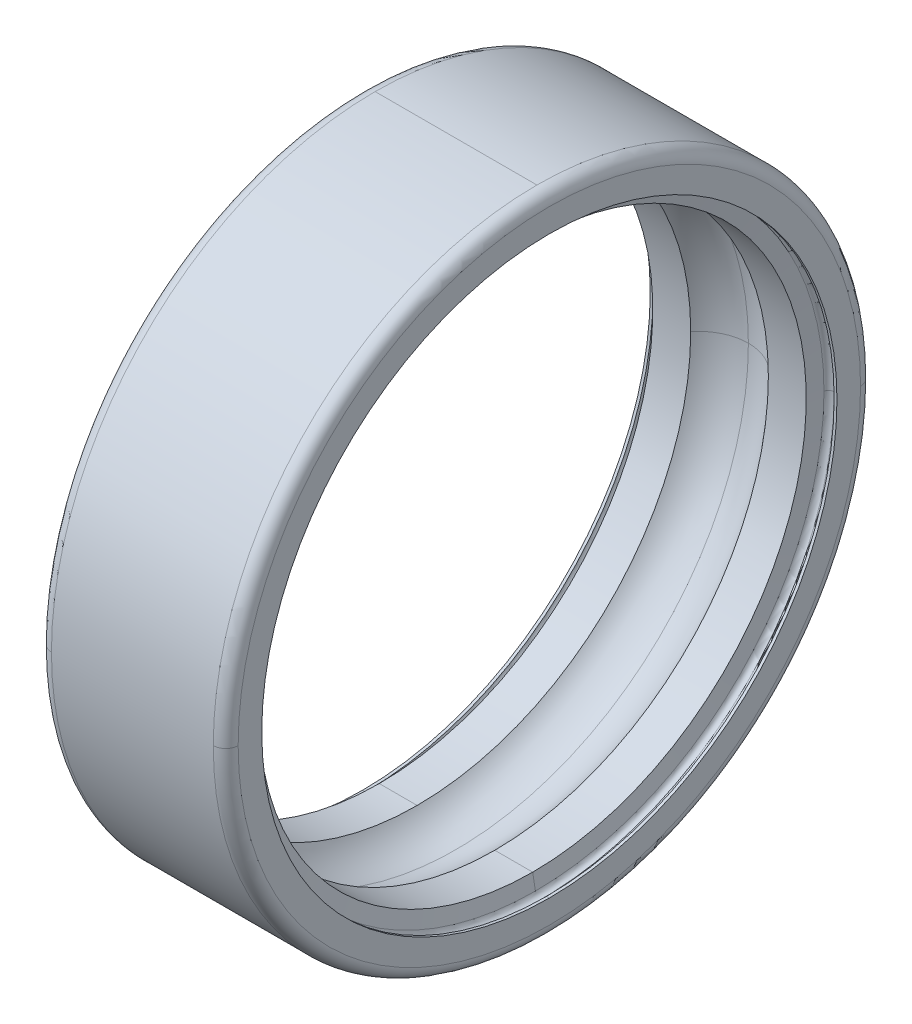
ISO-10303-21;
HEADER;
FILE_DESCRIPTION(('STEP AP214'),'2;1');
FILE_NAME('part.step','',(''),(''),'','','');
FILE_SCHEMA(('AUTOMOTIVE_DESIGN { 1 0 10303 214 1 1 1 1 }'));
ENDSEC;
DATA;
#1=APPLICATION_CONTEXT('core data for automotive mechanical design processes');
#2=APPLICATION_PROTOCOL_DEFINITION('international standard','automotive_design',2000,#1);
#3=PRODUCT_CONTEXT('',#1,'mechanical');
#4=PRODUCT('Part','Part','',(#3));
#5=PRODUCT_RELATED_PRODUCT_CATEGORY('part','',(#4));
#6=PRODUCT_DEFINITION_FORMATION('','',#4);
#7=PRODUCT_DEFINITION_CONTEXT('part definition',#1,'design');
#8=PRODUCT_DEFINITION('design','',#6,#7);
#9=PRODUCT_DEFINITION_SHAPE('','',#8);
#10=(LENGTH_UNIT() NAMED_UNIT(*) SI_UNIT(.MILLI.,.METRE.));
#11=(NAMED_UNIT(*) PLANE_ANGLE_UNIT() SI_UNIT($,.RADIAN.));
#12=(NAMED_UNIT(*) SI_UNIT($,.STERADIAN.) SOLID_ANGLE_UNIT());
#13=UNCERTAINTY_MEASURE_WITH_UNIT(LENGTH_MEASURE(1.E-05),#10,'distance_accuracy_value','');
#14=(GEOMETRIC_REPRESENTATION_CONTEXT(3) GLOBAL_UNCERTAINTY_ASSIGNED_CONTEXT((#13)) GLOBAL_UNIT_ASSIGNED_CONTEXT((#10,
#11,#12)) REPRESENTATION_CONTEXT('',''));
#15=CARTESIAN_POINT('',(0.,0.,0.));
#16=DIRECTION('',(0.,0.,1.));
#17=DIRECTION('',(1.,0.,0.));
#18=AXIS2_PLACEMENT_3D('',#15,#16,#17);
#19=CARTESIAN_POINT('',(14.322,0.,0.));
#20=DIRECTION('',(1.,0.,0.));
#21=DIRECTION('',(0.,0.,-1.));
#22=AXIS2_PLACEMENT_3D('',#19,#20,#21);
#23=TOROIDAL_SURFACE('',#22,23.105,0.452);
#24=CARTESIAN_POINT('',(14.322,0.,0.));
#25=DIRECTION('',(1.,0.,0.));
#26=DIRECTION('',(0.,0.,1.));
#27=AXIS2_PLACEMENT_3D('',#24,#25,#26);
#28=CIRCLE('',#27,23.557);
#29=CARTESIAN_POINT('',(14.322,0.,-23.557));
#30=VERTEX_POINT('',#29);
#31=CARTESIAN_POINT('',(14.322,0.,23.557));
#32=VERTEX_POINT('',#31);
#33=EDGE_CURVE('E440',#30,#32,#28,.T.);
#34=ORIENTED_EDGE('',*,*,#33,.T.);
#35=CARTESIAN_POINT('',(14.322,0.,23.105));
#36=DIRECTION('',(0.,-1.,0.));
#37=DIRECTION('',(0.,0.,1.));
#38=AXIS2_PLACEMENT_3D('',#35,#36,#37);
#39=CIRCLE('',#38,0.452);
#40=CARTESIAN_POINT('',(13.8768668956385,0.,23.1834889763055));
#41=VERTEX_POINT('',#40);
#42=EDGE_CURVE('E315',#32,#41,#39,.T.);
#43=ORIENTED_EDGE('',*,*,#42,.T.);
#44=CARTESIAN_POINT('',(13.8768668956385,0.,0.));
#45=DIRECTION('',(1.,0.,0.));
#46=DIRECTION('',(0.,1.,0.));
#47=AXIS2_PLACEMENT_3D('',#44,#45,#46);
#48=CIRCLE('',#47,23.1834889763055);
#49=CARTESIAN_POINT('',(13.8768668956385,23.1834889763055,0.));
#50=VERTEX_POINT('',#49);
#51=EDGE_CURVE('E30',#50,#41,#48,.T.);
#52=ORIENTED_EDGE('',*,*,#51,.F.);
#53=CARTESIAN_POINT('',(13.8768668956385,0.,0.));
#54=DIRECTION('',(1.,0.,0.));
#55=DIRECTION('',(0.,1.,0.));
#56=AXIS2_PLACEMENT_3D('',#53,#54,#55);
#57=CIRCLE('',#56,23.1834889763055);
#58=CARTESIAN_POINT('',(13.8768668956385,0.,-23.1834889763055));
#59=VERTEX_POINT('',#58);
#60=EDGE_CURVE('E214',#59,#50,#57,.T.);
#61=ORIENTED_EDGE('',*,*,#60,.F.);
#62=CARTESIAN_POINT('',(14.322,0.,-23.105));
#63=DIRECTION('',(0.,-1.,0.));
#64=DIRECTION('',(0.,0.,-1.));
#65=AXIS2_PLACEMENT_3D('',#62,#63,#64);
#66=CIRCLE('',#65,0.452);
#67=EDGE_CURVE('E301',#59,#30,#66,.T.);
#68=ORIENTED_EDGE('',*,*,#67,.T.);
#69=EDGE_LOOP('',(#34,#43,#52,#61,#68));
#70=FACE_BOUND('',#69,.T.);
#71=ADVANCED_FACE('F16',(#70),#23,.F.);
#72=CARTESIAN_POINT('',(14.887,0.,0.));
#73=DIRECTION('',(1.,0.,0.));
#74=DIRECTION('',(0.,1.,0.));
#75=AXIS2_PLACEMENT_3D('',#72,#73,#74);
#76=CYLINDRICAL_SURFACE('',#75,23.105);
#77=DIRECTION('',(1.,0.,0.));
#78=VECTOR('',#77,1.);
#79=CARTESIAN_POINT('',(14.887,23.105,0.));
#80=LINE('',#79,#78);
#81=CARTESIAN_POINT('',(14.774,23.105,0.));
#82=VERTEX_POINT('',#81);
#83=CARTESIAN_POINT('',(15.,23.105,0.));
#84=VERTEX_POINT('',#83);
#85=EDGE_CURVE('E318',#82,#84,#80,.T.);
#86=ORIENTED_EDGE('',*,*,#85,.T.);
#87=CARTESIAN_POINT('',(15.,0.,0.));
#88=DIRECTION('',(1.,0.,0.));
#89=DIRECTION('',(0.,1.,0.));
#90=AXIS2_PLACEMENT_3D('',#87,#88,#89);
#91=CIRCLE('',#90,23.105);
#92=CARTESIAN_POINT('',(15.,-23.105,0.));
#93=VERTEX_POINT('',#92);
#94=EDGE_CURVE('E11',#84,#93,#91,.T.);
#95=ORIENTED_EDGE('',*,*,#94,.T.);
#96=DIRECTION('',(-1.,0.,0.));
#97=VECTOR('',#96,1.);
#98=CARTESIAN_POINT('',(14.887,-23.105,0.));
#99=LINE('',#98,#97);
#100=CARTESIAN_POINT('',(14.774,-23.105,0.));
#101=VERTEX_POINT('',#100);
#102=EDGE_CURVE('E323',#93,#101,#99,.T.);
#103=ORIENTED_EDGE('',*,*,#102,.T.);
#104=CARTESIAN_POINT('',(14.774,0.,0.));
#105=DIRECTION('',(1.,0.,0.));
#106=DIRECTION('',(0.,1.,0.));
#107=AXIS2_PLACEMENT_3D('',#104,#105,#106);
#108=CIRCLE('',#107,23.105);
#109=CARTESIAN_POINT('',(14.774,0.,23.105));
#110=VERTEX_POINT('',#109);
#111=EDGE_CURVE('E290',#110,#101,#108,.T.);
#112=ORIENTED_EDGE('',*,*,#111,.F.);
#113=CARTESIAN_POINT('',(14.774,0.,0.));
#114=DIRECTION('',(1.,0.,0.));
#115=DIRECTION('',(0.,1.,0.));
#116=AXIS2_PLACEMENT_3D('',#113,#114,#115);
#117=CIRCLE('',#116,23.105);
#118=EDGE_CURVE('E443',#82,#110,#117,.T.);
#119=ORIENTED_EDGE('',*,*,#118,.F.);
#120=EDGE_LOOP('',(#86,#95,#103,#112,#119));
#121=FACE_BOUND('',#120,.T.);
#122=ADVANCED_FACE('F498',(#121),#76,.F.);
#123=CARTESIAN_POINT('',(15.,24.0525,0.));
#124=DIRECTION('',(1.,0.,0.));
#125=DIRECTION('',(0.,1.,0.));
#126=AXIS2_PLACEMENT_3D('',#123,#124,#125);
#127=PLANE('',#126);
#128=ORIENTED_EDGE('',*,*,#94,.F.);
#129=CARTESIAN_POINT('',(15.,0.,0.));
#130=DIRECTION('',(1.,0.,0.));
#131=DIRECTION('',(0.,1.,0.));
#132=AXIS2_PLACEMENT_3D('',#129,#130,#131);
#133=CIRCLE('',#132,23.105);
#134=EDGE_CURVE('E326',#93,#84,#133,.T.);
#135=ORIENTED_EDGE('',*,*,#134,.F.);
#136=EDGE_LOOP('',(#128,#135));
#137=FACE_BOUND('',#136,.T.);
#138=CARTESIAN_POINT('',(15.,0.,0.));
#139=DIRECTION('',(1.,0.,0.));
#140=DIRECTION('',(0.,1.,0.));
#141=AXIS2_PLACEMENT_3D('',#138,#139,#140);
#142=CIRCLE('',#141,25.);
#143=CARTESIAN_POINT('',(15.,0.,25.));
#144=VERTEX_POINT('',#143);
#145=CARTESIAN_POINT('',(15.,0.,-25.));
#146=VERTEX_POINT('',#145);
#147=EDGE_CURVE('E23',#144,#146,#142,.T.);
#148=ORIENTED_EDGE('',*,*,#147,.T.);
#149=CARTESIAN_POINT('',(15.,0.,0.));
#150=DIRECTION('',(1.,0.,0.));
#151=DIRECTION('',(0.,1.,0.));
#152=AXIS2_PLACEMENT_3D('',#149,#150,#151);
#153=CIRCLE('',#152,25.);
#154=EDGE_CURVE('E340',#146,#144,#153,.T.);
#155=ORIENTED_EDGE('',*,*,#154,.T.);
#156=EDGE_LOOP('',(#148,#155));
#157=FACE_BOUND('',#156,.T.);
#158=ADVANCED_FACE('F500',(#137,#157),#127,.T.);
#159=CARTESIAN_POINT('',(14.,0.,0.));
#160=DIRECTION('',(1.,0.,0.));
#161=DIRECTION('',(0.,0.,-1.));
#162=AXIS2_PLACEMENT_3D('',#159,#160,#161);
#163=TOROIDAL_SURFACE('',#162,25.,1.);
#164=CARTESIAN_POINT('',(14.,0.,-25.));
#165=DIRECTION('',(0.,-1.,0.));
#166=DIRECTION('',(0.,0.,-1.));
#167=AXIS2_PLACEMENT_3D('',#164,#165,#166);
#168=CIRCLE('',#167,1.);
#169=CARTESIAN_POINT('',(14.,0.,-26.));
#170=VERTEX_POINT('',#169);
#171=EDGE_CURVE('E330',#170,#146,#168,.T.);
#172=ORIENTED_EDGE('',*,*,#171,.T.);
#173=ORIENTED_EDGE('',*,*,#147,.F.);
#174=CARTESIAN_POINT('',(14.,0.,25.));
#175=DIRECTION('',(0.,-1.,0.));
#176=DIRECTION('',(0.,0.,1.));
#177=AXIS2_PLACEMENT_3D('',#174,#175,#176);
#178=CIRCLE('',#177,1.);
#179=CARTESIAN_POINT('',(14.,0.,26.));
#180=VERTEX_POINT('',#179);
#181=EDGE_CURVE('E337',#144,#180,#178,.T.);
#182=ORIENTED_EDGE('',*,*,#181,.T.);
#183=CARTESIAN_POINT('',(14.,0.,0.));
#184=DIRECTION('',(1.,0.,0.));
#185=DIRECTION('',(0.,1.,0.));
#186=AXIS2_PLACEMENT_3D('',#183,#184,#185);
#187=CIRCLE('',#186,26.);
#188=CARTESIAN_POINT('',(14.,-26.,0.));
#189=VERTEX_POINT('',#188);
#190=EDGE_CURVE('E354',#180,#189,#187,.T.);
#191=ORIENTED_EDGE('',*,*,#190,.T.);
#192=CARTESIAN_POINT('',(14.,0.,0.));
#193=DIRECTION('',(1.,0.,0.));
#194=DIRECTION('',(0.,1.,0.));
#195=AXIS2_PLACEMENT_3D('',#192,#193,#194);
#196=CIRCLE('',#195,26.);
#197=EDGE_CURVE('E224',#189,#170,#196,.T.);
#198=ORIENTED_EDGE('',*,*,#197,.T.);
#199=EDGE_LOOP('',(#172,#173,#182,#191,#198));
#200=FACE_BOUND('',#199,.T.);
#201=ADVANCED_FACE('F503',(#200),#163,.T.);
#202=CARTESIAN_POINT('',(7.5,0.,0.));
#203=DIRECTION('',(1.,0.,0.));
#204=DIRECTION('',(0.,1.,0.));
#205=AXIS2_PLACEMENT_3D('',#202,#203,#204);
#206=CYLINDRICAL_SURFACE('',#205,26.);
#207=DIRECTION('',(1.,0.,0.));
#208=VECTOR('',#207,1.);
#209=CARTESIAN_POINT('',(7.5,26.,0.));
#210=LINE('',#209,#208);
#211=CARTESIAN_POINT('',(1.,26.,0.));
#212=VERTEX_POINT('',#211);
#213=CARTESIAN_POINT('',(14.,26.,0.));
#214=VERTEX_POINT('',#213);
#215=EDGE_CURVE('E343',#212,#214,#210,.T.);
#216=ORIENTED_EDGE('',*,*,#215,.T.);
#217=CARTESIAN_POINT('',(14.,0.,0.));
#218=DIRECTION('',(1.,0.,0.));
#219=DIRECTION('',(0.,1.,0.));
#220=AXIS2_PLACEMENT_3D('',#217,#218,#219);
#221=CIRCLE('',#220,26.);
#222=EDGE_CURVE('E331',#170,#214,#221,.T.);
#223=ORIENTED_EDGE('',*,*,#222,.F.);
#224=ORIENTED_EDGE('',*,*,#197,.F.);
#225=DIRECTION('',(-1.,0.,0.));
#226=VECTOR('',#225,1.);
#227=CARTESIAN_POINT('',(7.5,-26.,0.));
#228=LINE('',#227,#226);
#229=CARTESIAN_POINT('',(1.,-26.,0.));
#230=VERTEX_POINT('',#229);
#231=EDGE_CURVE('E351',#189,#230,#228,.T.);
#232=ORIENTED_EDGE('',*,*,#231,.T.);
#233=CARTESIAN_POINT('',(1.,0.,0.));
#234=DIRECTION('',(1.,0.,0.));
#235=DIRECTION('',(0.,1.,0.));
#236=AXIS2_PLACEMENT_3D('',#233,#234,#235);
#237=CIRCLE('',#236,26.);
#238=CARTESIAN_POINT('',(1.,0.,-26.));
#239=VERTEX_POINT('',#238);
#240=EDGE_CURVE('E219',#230,#239,#237,.T.);
#241=ORIENTED_EDGE('',*,*,#240,.T.);
#242=CARTESIAN_POINT('',(1.,0.,0.));
#243=DIRECTION('',(1.,0.,0.));
#244=DIRECTION('',(0.,1.,0.));
#245=AXIS2_PLACEMENT_3D('',#242,#243,#244);
#246=CIRCLE('',#245,26.);
#247=EDGE_CURVE('E364',#239,#212,#246,.T.);
#248=ORIENTED_EDGE('',*,*,#247,.T.);
#249=EDGE_LOOP('',(#216,#223,#224,#232,#241,#248));
#250=FACE_BOUND('',#249,.T.);
#251=ADVANCED_FACE('F420',(#250),#206,.T.);
#252=CARTESIAN_POINT('',(1.,0.,0.));
#253=DIRECTION('',(1.,0.,0.));
#254=DIRECTION('',(0.,0.,-1.));
#255=AXIS2_PLACEMENT_3D('',#252,#253,#254);
#256=TOROIDAL_SURFACE('',#255,25.,1.);
#257=CARTESIAN_POINT('',(1.,0.,-25.));
#258=DIRECTION('',(0.,-1.,0.));
#259=DIRECTION('',(0.,0.,-1.));
#260=AXIS2_PLACEMENT_3D('',#257,#258,#259);
#261=CIRCLE('',#260,1.);
#262=CARTESIAN_POINT('',(0.,0.,-25.));
#263=VERTEX_POINT('',#262);
#264=EDGE_CURVE('E357',#263,#239,#261,.T.);
#265=ORIENTED_EDGE('',*,*,#264,.T.);
#266=ORIENTED_EDGE('',*,*,#240,.F.);
#267=CARTESIAN_POINT('',(1.,0.,0.));
#268=DIRECTION('',(1.,0.,0.));
#269=DIRECTION('',(0.,1.,0.));
#270=AXIS2_PLACEMENT_3D('',#267,#268,#269);
#271=CIRCLE('',#270,26.);
#272=CARTESIAN_POINT('',(1.,0.,26.));
#273=VERTEX_POINT('',#272);
#274=EDGE_CURVE('E348',#273,#230,#271,.T.);
#275=ORIENTED_EDGE('',*,*,#274,.F.);
#276=CARTESIAN_POINT('',(1.,0.,25.));
#277=DIRECTION('',(0.,-1.,0.));
#278=DIRECTION('',(0.,0.,1.));
#279=AXIS2_PLACEMENT_3D('',#276,#277,#278);
#280=CIRCLE('',#279,1.);
#281=CARTESIAN_POINT('',(0.,0.,25.));
#282=VERTEX_POINT('',#281);
#283=EDGE_CURVE('E362',#273,#282,#280,.T.);
#284=ORIENTED_EDGE('',*,*,#283,.T.);
#285=CARTESIAN_POINT('',(0.,0.,0.));
#286=DIRECTION('',(1.,0.,0.));
#287=DIRECTION('',(0.,1.,0.));
#288=AXIS2_PLACEMENT_3D('',#285,#286,#287);
#289=CIRCLE('',#288,25.);
#290=EDGE_CURVE('E218',#282,#263,#289,.T.);
#291=ORIENTED_EDGE('',*,*,#290,.T.);
#292=EDGE_LOOP('',(#265,#266,#275,#284,#291));
#293=FACE_BOUND('',#292,.T.);
#294=ADVANCED_FACE('F410',(#293),#256,.T.);
#295=CARTESIAN_POINT('',(0.,24.0525,0.));
#296=DIRECTION('',(-1.,0.,0.));
#297=DIRECTION('',(0.,0.,1.));
#298=AXIS2_PLACEMENT_3D('',#295,#296,#297);
#299=PLANE('',#298);
#300=CARTESIAN_POINT('',(0.,0.,0.));
#301=DIRECTION('',(1.,0.,0.));
#302=DIRECTION('',(0.,1.,0.));
#303=AXIS2_PLACEMENT_3D('',#300,#301,#302);
#304=CIRCLE('',#303,23.105);
#305=CARTESIAN_POINT('',(0.,23.105,0.));
#306=VERTEX_POINT('',#305);
#307=CARTESIAN_POINT('',(0.,-23.105,0.));
#308=VERTEX_POINT('',#307);
#309=EDGE_CURVE('E217',#306,#308,#304,.T.);
#310=ORIENTED_EDGE('',*,*,#309,.T.);
#311=CARTESIAN_POINT('',(0.,0.,0.));
#312=DIRECTION('',(1.,0.,0.));
#313=DIRECTION('',(0.,1.,0.));
#314=AXIS2_PLACEMENT_3D('',#311,#312,#313);
#315=CIRCLE('',#314,23.105);
#316=EDGE_CURVE('E265',#308,#306,#315,.T.);
#317=ORIENTED_EDGE('',*,*,#316,.T.);
#318=EDGE_LOOP('',(#310,#317));
#319=FACE_BOUND('',#318,.T.);
#320=CARTESIAN_POINT('',(0.,0.,0.));
#321=DIRECTION('',(1.,0.,0.));
#322=DIRECTION('',(0.,1.,0.));
#323=AXIS2_PLACEMENT_3D('',#320,#321,#322);
#324=CIRCLE('',#323,25.);
#325=EDGE_CURVE('E359',#263,#282,#324,.T.);
#326=ORIENTED_EDGE('',*,*,#325,.F.);
#327=ORIENTED_EDGE('',*,*,#290,.F.);
#328=EDGE_LOOP('',(#326,#327));
#329=FACE_BOUND('',#328,.T.);
#330=ADVANCED_FACE('F407',(#319,#329),#299,.T.);
#331=CARTESIAN_POINT('',(0.113,0.,0.));
#332=DIRECTION('',(1.,0.,0.));
#333=DIRECTION('',(0.,1.,0.));
#334=AXIS2_PLACEMENT_3D('',#331,#332,#333);
#335=CYLINDRICAL_SURFACE('',#334,23.105);
#336=DIRECTION('',(1.,0.,0.));
#337=VECTOR('',#336,1.);
#338=CARTESIAN_POINT('',(0.113,23.105,0.));
#339=LINE('',#338,#337);
#340=CARTESIAN_POINT('',(0.226,23.105,0.));
#341=VERTEX_POINT('',#340);
#342=EDGE_CURVE('E268',#306,#341,#339,.T.);
#343=ORIENTED_EDGE('',*,*,#342,.T.);
#344=CARTESIAN_POINT('',(0.226,0.,0.));
#345=DIRECTION('',(1.,0.,0.));
#346=DIRECTION('',(0.,1.,0.));
#347=AXIS2_PLACEMENT_3D('',#344,#345,#346);
#348=CIRCLE('',#347,23.105);
#349=CARTESIAN_POINT('',(0.226,0.,23.105));
#350=VERTEX_POINT('',#349);
#351=EDGE_CURVE('E216',#341,#350,#348,.T.);
#352=ORIENTED_EDGE('',*,*,#351,.T.);
#353=CARTESIAN_POINT('',(0.226,0.,0.));
#354=DIRECTION('',(1.,0.,0.));
#355=DIRECTION('',(0.,1.,0.));
#356=AXIS2_PLACEMENT_3D('',#353,#354,#355);
#357=CIRCLE('',#356,23.105);
#358=CARTESIAN_POINT('',(0.226,-23.105,0.));
#359=VERTEX_POINT('',#358);
#360=EDGE_CURVE('E295',#350,#359,#357,.T.);
#361=ORIENTED_EDGE('',*,*,#360,.T.);
#362=DIRECTION('',(-1.,0.,0.));
#363=VECTOR('',#362,1.);
#364=CARTESIAN_POINT('',(0.113,-23.105,0.));
#365=LINE('',#364,#363);
#366=EDGE_CURVE('E267',#359,#308,#365,.T.);
#367=ORIENTED_EDGE('',*,*,#366,.T.);
#368=ORIENTED_EDGE('',*,*,#309,.F.);
#369=EDGE_LOOP('',(#343,#352,#361,#367,#368));
#370=FACE_BOUND('',#369,.T.);
#371=ADVANCED_FACE('F402',(#370),#335,.F.);
#372=CARTESIAN_POINT('',(0.678,0.,0.));
#373=DIRECTION('',(1.,0.,0.));
#374=DIRECTION('',(0.,0.,-1.));
#375=AXIS2_PLACEMENT_3D('',#372,#373,#374);
#376=TOROIDAL_SURFACE('',#375,23.105,0.452);
#377=CARTESIAN_POINT('',(0.678,0.,0.));
#378=DIRECTION('',(1.,0.,0.));
#379=DIRECTION('',(0.,0.,1.));
#380=AXIS2_PLACEMENT_3D('',#377,#378,#379);
#381=CIRCLE('',#380,23.557);
#382=CARTESIAN_POINT('',(0.678,0.,-23.557));
#383=VERTEX_POINT('',#382);
#384=CARTESIAN_POINT('',(0.678,0.,23.557));
#385=VERTEX_POINT('',#384);
#386=EDGE_CURVE('E240',#383,#385,#381,.T.);
#387=ORIENTED_EDGE('',*,*,#386,.T.);
#388=CARTESIAN_POINT('',(0.678,0.,23.105));
#389=DIRECTION('',(0.,-1.,0.));
#390=DIRECTION('',(0.,0.,1.));
#391=AXIS2_PLACEMENT_3D('',#388,#389,#390);
#392=CIRCLE('',#391,0.452);
#393=EDGE_CURVE('E291',#385,#350,#392,.T.);
#394=ORIENTED_EDGE('',*,*,#393,.T.);
#395=ORIENTED_EDGE('',*,*,#351,.F.);
#396=CARTESIAN_POINT('',(0.226,0.,0.));
#397=DIRECTION('',(1.,0.,0.));
#398=DIRECTION('',(0.,1.,0.));
#399=AXIS2_PLACEMENT_3D('',#396,#397,#398);
#400=CIRCLE('',#399,23.105);
#401=CARTESIAN_POINT('',(0.226,0.,-23.105));
#402=VERTEX_POINT('',#401);
#403=EDGE_CURVE('E279',#402,#341,#400,.T.);
#404=ORIENTED_EDGE('',*,*,#403,.F.);
#405=CARTESIAN_POINT('',(0.678,0.,-23.105));
#406=DIRECTION('',(0.,-1.,0.));
#407=DIRECTION('',(0.,0.,-1.));
#408=AXIS2_PLACEMENT_3D('',#405,#406,#407);
#409=CIRCLE('',#408,0.452);
#410=EDGE_CURVE('E282',#402,#383,#409,.T.);
#411=ORIENTED_EDGE('',*,*,#410,.T.);
#412=EDGE_LOOP('',(#387,#394,#395,#404,#411));
#413=FACE_BOUND('',#412,.T.);
#414=ADVANCED_FACE('F394',(#413),#376,.F.);
#415=CARTESIAN_POINT('',(1.22967771056722,0.,0.));
#416=DIRECTION('',(-1.,0.,0.));
#417=DIRECTION('',(0.,1.,0.));
#418=AXIS2_PLACEMENT_3D('',#415,#416,#417);
#419=CONICAL_SURFACE('',#418,22.5792444881527,1.39626340159546);
#420=DIRECTION('',(0.173648177666931,-0.984807753012208,0.));
#421=VECTOR('',#420,1.);
#422=CARTESIAN_POINT('',(1.22967771056722,22.5792444881527,0.));
#423=LINE('',#422,#421);
#424=CARTESIAN_POINT('',(1.12313310436152,23.1834889763055,0.));
#425=VERTEX_POINT('',#424);
#426=CARTESIAN_POINT('',(1.33622231677292,21.975,0.));
#427=VERTEX_POINT('',#426);
#428=EDGE_CURVE('E294',#425,#427,#423,.T.);
#429=ORIENTED_EDGE('',*,*,#428,.T.);
#430=CARTESIAN_POINT('',(1.33622231677292,0.,0.));
#431=DIRECTION('',(1.,0.,0.));
#432=DIRECTION('',(0.,1.,0.));
#433=AXIS2_PLACEMENT_3D('',#430,#431,#432);
#434=CIRCLE('',#433,21.975);
#435=CARTESIAN_POINT('',(1.33622231677292,-21.975,0.));
#436=VERTEX_POINT('',#435);
#437=EDGE_CURVE('E181',#427,#436,#434,.T.);
#438=ORIENTED_EDGE('',*,*,#437,.T.);
#439=DIRECTION('',(-0.173648177666931,-0.984807753012208,0.));
#440=VECTOR('',#439,1.);
#441=CARTESIAN_POINT('',(1.22967771056722,-22.5792444881527,0.));
#442=LINE('',#441,#440);
#443=CARTESIAN_POINT('',(1.12313310436152,-23.1834889763055,0.));
#444=VERTEX_POINT('',#443);
#445=EDGE_CURVE('E302',#436,#444,#442,.T.);
#446=ORIENTED_EDGE('',*,*,#445,.T.);
#447=CARTESIAN_POINT('',(1.12313310436152,0.,0.));
#448=DIRECTION('',(1.,0.,0.));
#449=DIRECTION('',(0.,1.,0.));
#450=AXIS2_PLACEMENT_3D('',#447,#448,#449);
#451=CIRCLE('',#450,23.1834889763055);
#452=CARTESIAN_POINT('',(1.12313310436152,0.,23.1834889763055));
#453=VERTEX_POINT('',#452);
#454=EDGE_CURVE('E278',#453,#444,#451,.T.);
#455=ORIENTED_EDGE('',*,*,#454,.F.);
#456=CARTESIAN_POINT('',(1.12313310436152,0.,0.));
#457=DIRECTION('',(1.,0.,0.));
#458=DIRECTION('',(0.,1.,0.));
#459=AXIS2_PLACEMENT_3D('',#456,#457,#458);
#460=CIRCLE('',#459,23.1834889763055);
#461=EDGE_CURVE('E237',#425,#453,#460,.T.);
#462=ORIENTED_EDGE('',*,*,#461,.F.);
#463=EDGE_LOOP('',(#429,#438,#446,#455,#462));
#464=FACE_BOUND('',#463,.T.);
#465=ADVANCED_FACE('F383',(#464),#419,.F.);
#466=CARTESIAN_POINT('',(2.85878951100258,0.,0.));
#467=DIRECTION('',(1.,0.,0.));
#468=DIRECTION('',(0.,1.,0.));
#469=AXIS2_PLACEMENT_3D('',#466,#467,#468);
#470=CYLINDRICAL_SURFACE('',#469,21.975);
#471=DIRECTION('',(1.,0.,0.));
#472=VECTOR('',#471,1.);
#473=CARTESIAN_POINT('',(2.85878951100258,21.975,0.));
#474=LINE('',#473,#472);
#475=CARTESIAN_POINT('',(4.38135670523223,21.975,0.));
#476=VERTEX_POINT('',#475);
#477=EDGE_CURVE('E177',#427,#476,#474,.T.);
#478=ORIENTED_EDGE('',*,*,#477,.T.);
#479=CARTESIAN_POINT('',(4.38135670523223,0.,0.));
#480=DIRECTION('',(1.,0.,0.));
#481=DIRECTION('',(0.,1.,0.));
#482=AXIS2_PLACEMENT_3D('',#479,#480,#481);
#483=CIRCLE('',#482,21.975);
#484=CARTESIAN_POINT('',(4.38135670523223,0.,21.975));
#485=VERTEX_POINT('',#484);
#486=EDGE_CURVE('E169',#476,#485,#483,.T.);
#487=ORIENTED_EDGE('',*,*,#486,.T.);
#488=CARTESIAN_POINT('',(4.38135670523223,0.,0.));
#489=DIRECTION('',(1.,0.,0.));
#490=DIRECTION('',(0.,1.,0.));
#491=AXIS2_PLACEMENT_3D('',#488,#489,#490);
#492=CIRCLE('',#491,21.975);
#493=CARTESIAN_POINT('',(4.38135670523223,-21.975,0.));
#494=VERTEX_POINT('',#493);
#495=EDGE_CURVE('E174',#485,#494,#492,.T.);
#496=ORIENTED_EDGE('',*,*,#495,.T.);
#497=DIRECTION('',(-1.,0.,0.));
#498=VECTOR('',#497,1.);
#499=CARTESIAN_POINT('',(2.85878951100258,-21.975,0.));
#500=LINE('',#499,#498);
#501=EDGE_CURVE('E320',#494,#436,#500,.T.);
#502=ORIENTED_EDGE('',*,*,#501,.T.);
#503=ORIENTED_EDGE('',*,*,#437,.F.);
#504=EDGE_LOOP('',(#478,#487,#496,#502,#503));
#505=FACE_BOUND('',#504,.T.);
#506=ADVANCED_FACE('F171',(#505),#470,.F.);
#507=CARTESIAN_POINT('',(7.5,0.,0.));
#508=DIRECTION('',(1.,0.,0.));
#509=DIRECTION('',(0.,0.,-1.));
#510=AXIS2_PLACEMENT_3D('',#507,#508,#509);
#511=TOROIDAL_SURFACE('',#510,19.52,3.969);
#512=CARTESIAN_POINT('',(7.5,0.,0.));
#513=DIRECTION('',(1.,0.,0.));
#514=DIRECTION('',(0.,0.,1.));
#515=AXIS2_PLACEMENT_3D('',#512,#513,#514);
#516=CIRCLE('',#515,23.489);
#517=CARTESIAN_POINT('',(7.5,0.,-23.489));
#518=VERTEX_POINT('',#517);
#519=CARTESIAN_POINT('',(7.5,0.,23.489));
#520=VERTEX_POINT('',#519);
#521=EDGE_CURVE('E188',#518,#520,#516,.T.);
#522=ORIENTED_EDGE('',*,*,#521,.T.);
#523=CARTESIAN_POINT('',(7.5,0.,19.52));
#524=DIRECTION('',(0.,-1.,0.));
#525=DIRECTION('',(0.,0.,1.));
#526=AXIS2_PLACEMENT_3D('',#523,#524,#525);
#527=CIRCLE('',#526,3.969);
#528=EDGE_CURVE('E184',#520,#485,#527,.T.);
#529=ORIENTED_EDGE('',*,*,#528,.T.);
#530=ORIENTED_EDGE('',*,*,#486,.F.);
#531=CARTESIAN_POINT('',(4.38135670523223,0.,0.));
#532=DIRECTION('',(1.,0.,0.));
#533=DIRECTION('',(0.,1.,0.));
#534=AXIS2_PLACEMENT_3D('',#531,#532,#533);
#535=CIRCLE('',#534,21.975);
#536=CARTESIAN_POINT('',(4.38135670523223,0.,-21.975));
#537=VERTEX_POINT('',#536);
#538=EDGE_CURVE('E200',#537,#476,#535,.T.);
#539=ORIENTED_EDGE('',*,*,#538,.F.);
#540=CARTESIAN_POINT('',(7.5,0.,-19.52));
#541=DIRECTION('',(0.,-1.,0.));
#542=DIRECTION('',(0.,0.,-1.));
#543=AXIS2_PLACEMENT_3D('',#540,#541,#542);
#544=CIRCLE('',#543,3.969);
#545=EDGE_CURVE('E198',#537,#518,#544,.T.);
#546=ORIENTED_EDGE('',*,*,#545,.T.);
#547=EDGE_LOOP('',(#522,#529,#530,#539,#546));
#548=FACE_BOUND('',#547,.T.);
#549=ADVANCED_FACE('F185',(#548),#511,.F.);
#550=CARTESIAN_POINT('',(12.1412104889974,0.,0.));
#551=DIRECTION('',(1.,0.,0.));
#552=DIRECTION('',(0.,1.,0.));
#553=AXIS2_PLACEMENT_3D('',#550,#551,#552);
#554=CYLINDRICAL_SURFACE('',#553,21.975);
#555=DIRECTION('',(1.,0.,0.));
#556=VECTOR('',#555,1.);
#557=CARTESIAN_POINT('',(12.1412104889974,21.975,0.));
#558=LINE('',#557,#556);
#559=CARTESIAN_POINT('',(10.6186432947678,21.975,0.));
#560=VERTEX_POINT('',#559);
#561=CARTESIAN_POINT('',(13.6637776832271,21.975,0.));
#562=VERTEX_POINT('',#561);
#563=EDGE_CURVE('E192',#560,#562,#558,.T.);
#564=ORIENTED_EDGE('',*,*,#563,.T.);
#565=CARTESIAN_POINT('',(13.6637776832271,0.,0.));
#566=DIRECTION('',(1.,0.,0.));
#567=DIRECTION('',(0.,1.,0.));
#568=AXIS2_PLACEMENT_3D('',#565,#566,#567);
#569=CIRCLE('',#568,21.975);
#570=CARTESIAN_POINT('',(13.6637776832271,-21.975,0.));
#571=VERTEX_POINT('',#570);
#572=EDGE_CURVE('E39',#562,#571,#569,.T.);
#573=ORIENTED_EDGE('',*,*,#572,.T.);
#574=DIRECTION('',(-1.,0.,0.));
#575=VECTOR('',#574,1.);
#576=CARTESIAN_POINT('',(12.1412104889974,-21.975,0.));
#577=LINE('',#576,#575);
#578=CARTESIAN_POINT('',(10.6186432947678,-21.975,0.));
#579=VERTEX_POINT('',#578);
#580=EDGE_CURVE('E204',#571,#579,#577,.T.);
#581=ORIENTED_EDGE('',*,*,#580,.T.);
#582=CARTESIAN_POINT('',(10.6186432947678,0.,0.));
#583=DIRECTION('',(1.,0.,0.));
#584=DIRECTION('',(0.,1.,0.));
#585=AXIS2_PLACEMENT_3D('',#582,#583,#584);
#586=CIRCLE('',#585,21.975);
#587=CARTESIAN_POINT('',(10.6186432947678,0.,21.975));
#588=VERTEX_POINT('',#587);
#589=EDGE_CURVE('E264',#588,#579,#586,.T.);
#590=ORIENTED_EDGE('',*,*,#589,.F.);
#591=CARTESIAN_POINT('',(10.6186432947678,0.,0.));
#592=DIRECTION('',(1.,0.,0.));
#593=DIRECTION('',(0.,1.,0.));
#594=AXIS2_PLACEMENT_3D('',#591,#592,#593);
#595=CIRCLE('',#594,21.975);
#596=EDGE_CURVE('E254',#560,#588,#595,.T.);
#597=ORIENTED_EDGE('',*,*,#596,.F.);
#598=EDGE_LOOP('',(#564,#573,#581,#590,#597));
#599=FACE_BOUND('',#598,.T.);
#600=ADVANCED_FACE('F476',(#599),#554,.F.);
#601=CARTESIAN_POINT('',(13.7703222894328,0.,0.));
#602=DIRECTION('',(1.,0.,0.));
#603=DIRECTION('',(0.,1.,0.));
#604=AXIS2_PLACEMENT_3D('',#601,#602,#603);
#605=CONICAL_SURFACE('',#604,22.5792444881527,1.39626340159547);
#606=DIRECTION('',(0.173648177666928,0.984807753012208,0.));
#607=VECTOR('',#606,1.);
#608=CARTESIAN_POINT('',(13.7703222894328,22.5792444881527,0.));
#609=LINE('',#608,#607);
#610=EDGE_CURVE('E209',#562,#50,#609,.T.);
#611=ORIENTED_EDGE('',*,*,#610,.T.);
#612=ORIENTED_EDGE('',*,*,#51,.T.);
#613=CARTESIAN_POINT('',(13.8768668956385,0.,0.));
#614=DIRECTION('',(1.,0.,0.));
#615=DIRECTION('',(0.,1.,0.));
#616=AXIS2_PLACEMENT_3D('',#613,#614,#615);
#617=CIRCLE('',#616,23.1834889763055);
#618=CARTESIAN_POINT('',(13.8768668956385,-23.1834889763055,0.));
#619=VERTEX_POINT('',#618);
#620=EDGE_CURVE('E312',#41,#619,#617,.T.);
#621=ORIENTED_EDGE('',*,*,#620,.T.);
#622=DIRECTION('',(-0.173648177666928,0.984807753012208,0.));
#623=VECTOR('',#622,1.);
#624=CARTESIAN_POINT('',(13.7703222894328,-22.5792444881527,0.));
#625=LINE('',#624,#623);
#626=EDGE_CURVE('E212',#619,#571,#625,.T.);
#627=ORIENTED_EDGE('',*,*,#626,.T.);
#628=ORIENTED_EDGE('',*,*,#572,.F.);
#629=EDGE_LOOP('',(#611,#612,#621,#627,#628));
#630=FACE_BOUND('',#629,.T.);
#631=ADVANCED_FACE('F485',(#630),#605,.F.);
#632=CARTESIAN_POINT('',(13.7703222894328,0.,0.));
#633=DIRECTION('',(1.,0.,0.));
#634=DIRECTION('',(0.,1.,0.));
#635=AXIS2_PLACEMENT_3D('',#632,#633,#634);
#636=CONICAL_SURFACE('',#635,22.5792444881527,1.39626340159547);
#637=ORIENTED_EDGE('',*,*,#610,.F.);
#638=CARTESIAN_POINT('',(13.6637776832271,0.,0.));
#639=DIRECTION('',(1.,0.,0.));
#640=DIRECTION('',(0.,1.,0.));
#641=AXIS2_PLACEMENT_3D('',#638,#639,#640);
#642=CIRCLE('',#641,21.975);
#643=EDGE_CURVE('E206',#571,#562,#642,.T.);
#644=ORIENTED_EDGE('',*,*,#643,.F.);
#645=ORIENTED_EDGE('',*,*,#626,.F.);
#646=CARTESIAN_POINT('',(13.8768668956385,0.,0.));
#647=DIRECTION('',(1.,0.,0.));
#648=DIRECTION('',(0.,1.,0.));
#649=AXIS2_PLACEMENT_3D('',#646,#647,#648);
#650=CIRCLE('',#649,23.1834889763055);
#651=EDGE_CURVE('E307',#619,#59,#650,.T.);
#652=ORIENTED_EDGE('',*,*,#651,.T.);
#653=ORIENTED_EDGE('',*,*,#60,.T.);
#654=EDGE_LOOP('',(#637,#644,#645,#652,#653));
#655=FACE_BOUND('',#654,.T.);
#656=ADVANCED_FACE('F483',(#655),#636,.F.);
#657=CARTESIAN_POINT('',(12.1412104889974,0.,0.));
#658=DIRECTION('',(1.,0.,0.));
#659=DIRECTION('',(0.,1.,0.));
#660=AXIS2_PLACEMENT_3D('',#657,#658,#659);
#661=CYLINDRICAL_SURFACE('',#660,21.975);
#662=ORIENTED_EDGE('',*,*,#563,.F.);
#663=CARTESIAN_POINT('',(10.6186432947678,0.,0.));
#664=DIRECTION('',(1.,0.,0.));
#665=DIRECTION('',(0.,1.,0.));
#666=AXIS2_PLACEMENT_3D('',#663,#664,#665);
#667=CIRCLE('',#666,21.975);
#668=CARTESIAN_POINT('',(10.6186432947678,0.,-21.975));
#669=VERTEX_POINT('',#668);
#670=EDGE_CURVE('E251',#669,#560,#667,.T.);
#671=ORIENTED_EDGE('',*,*,#670,.F.);
#672=CARTESIAN_POINT('',(10.6186432947678,0.,0.));
#673=DIRECTION('',(1.,0.,0.));
#674=DIRECTION('',(0.,1.,0.));
#675=AXIS2_PLACEMENT_3D('',#672,#673,#674);
#676=CIRCLE('',#675,21.975);
#677=EDGE_CURVE('E271',#579,#669,#676,.T.);
#678=ORIENTED_EDGE('',*,*,#677,.F.);
#679=ORIENTED_EDGE('',*,*,#580,.F.);
#680=ORIENTED_EDGE('',*,*,#643,.T.);
#681=EDGE_LOOP('',(#662,#671,#678,#679,#680));
#682=FACE_BOUND('',#681,.T.);
#683=ADVANCED_FACE('F479',(#682),#661,.F.);
#684=CARTESIAN_POINT('',(7.5,0.,0.));
#685=DIRECTION('',(1.,0.,0.));
#686=DIRECTION('',(0.,0.,-1.));
#687=AXIS2_PLACEMENT_3D('',#684,#685,#686);
#688=TOROIDAL_SURFACE('',#687,19.52,3.969);
#689=CARTESIAN_POINT('',(7.5,0.,0.));
#690=DIRECTION('',(1.,0.,0.));
#691=DIRECTION('',(0.,0.,1.));
#692=AXIS2_PLACEMENT_3D('',#689,#690,#691);
#693=CIRCLE('',#692,23.489);
#694=EDGE_CURVE('E261',#520,#518,#693,.T.);
#695=ORIENTED_EDGE('',*,*,#694,.T.);
#696=ORIENTED_EDGE('',*,*,#545,.F.);
#697=CARTESIAN_POINT('',(4.38135670523223,0.,0.));
#698=DIRECTION('',(1.,0.,0.));
#699=DIRECTION('',(0.,1.,0.));
#700=AXIS2_PLACEMENT_3D('',#697,#698,#699);
#701=CIRCLE('',#700,21.975);
#702=EDGE_CURVE('E196',#494,#537,#701,.T.);
#703=ORIENTED_EDGE('',*,*,#702,.F.);
#704=ORIENTED_EDGE('',*,*,#495,.F.);
#705=ORIENTED_EDGE('',*,*,#528,.F.);
#706=EDGE_LOOP('',(#695,#696,#703,#704,#705));
#707=FACE_BOUND('',#706,.T.);
#708=ADVANCED_FACE('F194',(#707),#688,.F.);
#709=CARTESIAN_POINT('',(2.85878951100258,0.,0.));
#710=DIRECTION('',(1.,0.,0.));
#711=DIRECTION('',(0.,1.,0.));
#712=AXIS2_PLACEMENT_3D('',#709,#710,#711);
#713=CYLINDRICAL_SURFACE('',#712,21.975);
#714=ORIENTED_EDGE('',*,*,#477,.F.);
#715=CARTESIAN_POINT('',(1.33622231677292,0.,0.));
#716=DIRECTION('',(1.,0.,0.));
#717=DIRECTION('',(0.,1.,0.));
#718=AXIS2_PLACEMENT_3D('',#715,#716,#717);
#719=CIRCLE('',#718,21.975);
#720=EDGE_CURVE('E304',#436,#427,#719,.T.);
#721=ORIENTED_EDGE('',*,*,#720,.F.);
#722=ORIENTED_EDGE('',*,*,#501,.F.);
#723=ORIENTED_EDGE('',*,*,#702,.T.);
#724=ORIENTED_EDGE('',*,*,#538,.T.);
#725=EDGE_LOOP('',(#714,#721,#722,#723,#724));
#726=FACE_BOUND('',#725,.T.);
#727=ADVANCED_FACE('F377',(#726),#713,.F.);
#728=CARTESIAN_POINT('',(1.22967771056722,0.,0.));
#729=DIRECTION('',(-1.,0.,0.));
#730=DIRECTION('',(0.,1.,0.));
#731=AXIS2_PLACEMENT_3D('',#728,#729,#730);
#732=CONICAL_SURFACE('',#731,22.5792444881527,1.39626340159546);
#733=ORIENTED_EDGE('',*,*,#428,.F.);
#734=CARTESIAN_POINT('',(1.12313310436152,0.,0.));
#735=DIRECTION('',(1.,0.,0.));
#736=DIRECTION('',(0.,1.,0.));
#737=AXIS2_PLACEMENT_3D('',#734,#735,#736);
#738=CIRCLE('',#737,23.1834889763055);
#739=CARTESIAN_POINT('',(1.12313310436152,0.,-23.1834889763055));
#740=VERTEX_POINT('',#739);
#741=EDGE_CURVE('E234',#740,#425,#738,.T.);
#742=ORIENTED_EDGE('',*,*,#741,.F.);
#743=CARTESIAN_POINT('',(1.12313310436152,0.,0.));
#744=DIRECTION('',(1.,0.,0.));
#745=DIRECTION('',(0.,1.,0.));
#746=AXIS2_PLACEMENT_3D('',#743,#744,#745);
#747=CIRCLE('',#746,23.1834889763055);
#748=EDGE_CURVE('E285',#444,#740,#747,.T.);
#749=ORIENTED_EDGE('',*,*,#748,.F.);
#750=ORIENTED_EDGE('',*,*,#445,.F.);
#751=ORIENTED_EDGE('',*,*,#720,.T.);
#752=EDGE_LOOP('',(#733,#742,#749,#750,#751));
#753=FACE_BOUND('',#752,.T.);
#754=ADVANCED_FACE('F380',(#753),#732,.F.);
#755=CARTESIAN_POINT('',(0.678,0.,0.));
#756=DIRECTION('',(1.,0.,0.));
#757=DIRECTION('',(0.,0.,-1.));
#758=AXIS2_PLACEMENT_3D('',#755,#756,#757);
#759=TOROIDAL_SURFACE('',#758,23.105,0.452);
#760=CARTESIAN_POINT('',(0.678,0.,0.));
#761=DIRECTION('',(1.,0.,0.));
#762=DIRECTION('',(0.,0.,1.));
#763=AXIS2_PLACEMENT_3D('',#760,#761,#762);
#764=CIRCLE('',#763,23.557);
#765=EDGE_CURVE('E275',#385,#383,#764,.T.);
#766=ORIENTED_EDGE('',*,*,#765,.T.);
#767=ORIENTED_EDGE('',*,*,#410,.F.);
#768=CARTESIAN_POINT('',(0.226,0.,0.));
#769=DIRECTION('',(1.,0.,0.));
#770=DIRECTION('',(0.,1.,0.));
#771=AXIS2_PLACEMENT_3D('',#768,#769,#770);
#772=CIRCLE('',#771,23.105);
#773=EDGE_CURVE('E273',#359,#402,#772,.T.);
#774=ORIENTED_EDGE('',*,*,#773,.F.);
#775=ORIENTED_EDGE('',*,*,#360,.F.);
#776=ORIENTED_EDGE('',*,*,#393,.F.);
#777=EDGE_LOOP('',(#766,#767,#774,#775,#776));
#778=FACE_BOUND('',#777,.T.);
#779=ADVANCED_FACE('F399',(#778),#759,.F.);
#780=CARTESIAN_POINT('',(0.113,0.,0.));
#781=DIRECTION('',(1.,0.,0.));
#782=DIRECTION('',(0.,1.,0.));
#783=AXIS2_PLACEMENT_3D('',#780,#781,#782);
#784=CYLINDRICAL_SURFACE('',#783,23.105);
#785=ORIENTED_EDGE('',*,*,#342,.F.);
#786=ORIENTED_EDGE('',*,*,#316,.F.);
#787=ORIENTED_EDGE('',*,*,#366,.F.);
#788=ORIENTED_EDGE('',*,*,#773,.T.);
#789=ORIENTED_EDGE('',*,*,#403,.T.);
#790=EDGE_LOOP('',(#785,#786,#787,#788,#789));
#791=FACE_BOUND('',#790,.T.);
#792=ADVANCED_FACE('F406',(#791),#784,.F.);
#793=CARTESIAN_POINT('',(1.,0.,0.));
#794=DIRECTION('',(1.,0.,0.));
#795=DIRECTION('',(0.,0.,-1.));
#796=AXIS2_PLACEMENT_3D('',#793,#794,#795);
#797=TOROIDAL_SURFACE('',#796,25.,1.);
#798=ORIENTED_EDGE('',*,*,#264,.F.);
#799=ORIENTED_EDGE('',*,*,#325,.T.);
#800=ORIENTED_EDGE('',*,*,#283,.F.);
#801=CARTESIAN_POINT('',(1.,0.,0.));
#802=DIRECTION('',(1.,0.,0.));
#803=DIRECTION('',(0.,1.,0.));
#804=AXIS2_PLACEMENT_3D('',#801,#802,#803);
#805=CIRCLE('',#804,26.);
#806=EDGE_CURVE('E345',#212,#273,#805,.T.);
#807=ORIENTED_EDGE('',*,*,#806,.F.);
#808=ORIENTED_EDGE('',*,*,#247,.F.);
#809=EDGE_LOOP('',(#798,#799,#800,#807,#808));
#810=FACE_BOUND('',#809,.T.);
#811=ADVANCED_FACE('F415',(#810),#797,.T.);
#812=CARTESIAN_POINT('',(7.5,0.,0.));
#813=DIRECTION('',(1.,0.,0.));
#814=DIRECTION('',(0.,1.,0.));
#815=AXIS2_PLACEMENT_3D('',#812,#813,#814);
#816=CYLINDRICAL_SURFACE('',#815,26.);
#817=ORIENTED_EDGE('',*,*,#215,.F.);
#818=ORIENTED_EDGE('',*,*,#806,.T.);
#819=ORIENTED_EDGE('',*,*,#274,.T.);
#820=ORIENTED_EDGE('',*,*,#231,.F.);
#821=ORIENTED_EDGE('',*,*,#190,.F.);
#822=CARTESIAN_POINT('',(14.,0.,0.));
#823=DIRECTION('',(1.,0.,0.));
#824=DIRECTION('',(0.,1.,0.));
#825=AXIS2_PLACEMENT_3D('',#822,#823,#824);
#826=CIRCLE('',#825,26.);
#827=EDGE_CURVE('E334',#214,#180,#826,.T.);
#828=ORIENTED_EDGE('',*,*,#827,.F.);
#829=EDGE_LOOP('',(#817,#818,#819,#820,#821,#828));
#830=FACE_BOUND('',#829,.T.);
#831=ADVANCED_FACE('F424',(#830),#816,.T.);
#832=CARTESIAN_POINT('',(14.,0.,0.));
#833=DIRECTION('',(1.,0.,0.));
#834=DIRECTION('',(0.,0.,-1.));
#835=AXIS2_PLACEMENT_3D('',#832,#833,#834);
#836=TOROIDAL_SURFACE('',#835,25.,1.);
#837=ORIENTED_EDGE('',*,*,#171,.F.);
#838=ORIENTED_EDGE('',*,*,#222,.T.);
#839=ORIENTED_EDGE('',*,*,#827,.T.);
#840=ORIENTED_EDGE('',*,*,#181,.F.);
#841=ORIENTED_EDGE('',*,*,#154,.F.);
#842=EDGE_LOOP('',(#837,#838,#839,#840,#841));
#843=FACE_BOUND('',#842,.T.);
#844=ADVANCED_FACE('F430',(#843),#836,.T.);
#845=CARTESIAN_POINT('',(14.887,0.,0.));
#846=DIRECTION('',(1.,0.,0.));
#847=DIRECTION('',(0.,1.,0.));
#848=AXIS2_PLACEMENT_3D('',#845,#846,#847);
#849=CYLINDRICAL_SURFACE('',#848,23.105);
#850=ORIENTED_EDGE('',*,*,#85,.F.);
#851=CARTESIAN_POINT('',(14.774,0.,0.));
#852=DIRECTION('',(1.,0.,0.));
#853=DIRECTION('',(0.,1.,0.));
#854=AXIS2_PLACEMENT_3D('',#851,#852,#853);
#855=CIRCLE('',#854,23.105);
#856=CARTESIAN_POINT('',(14.774,0.,-23.105));
#857=VERTEX_POINT('',#856);
#858=EDGE_CURVE('E439',#857,#82,#855,.T.);
#859=ORIENTED_EDGE('',*,*,#858,.F.);
#860=CARTESIAN_POINT('',(14.774,0.,0.));
#861=DIRECTION('',(1.,0.,0.));
#862=DIRECTION('',(0.,1.,0.));
#863=AXIS2_PLACEMENT_3D('',#860,#861,#862);
#864=CIRCLE('',#863,23.105);
#865=EDGE_CURVE('E298',#101,#857,#864,.T.);
#866=ORIENTED_EDGE('',*,*,#865,.F.);
#867=ORIENTED_EDGE('',*,*,#102,.F.);
#868=ORIENTED_EDGE('',*,*,#134,.T.);
#869=EDGE_LOOP('',(#850,#859,#866,#867,#868));
#870=FACE_BOUND('',#869,.T.);
#871=ADVANCED_FACE('F494',(#870),#849,.F.);
#872=CARTESIAN_POINT('',(14.322,0.,0.));
#873=DIRECTION('',(1.,0.,0.));
#874=DIRECTION('',(0.,0.,-1.));
#875=AXIS2_PLACEMENT_3D('',#872,#873,#874);
#876=TOROIDAL_SURFACE('',#875,23.105,0.452);
#877=CARTESIAN_POINT('',(14.322,0.,0.));
#878=DIRECTION('',(1.,0.,0.));
#879=DIRECTION('',(0.,0.,1.));
#880=AXIS2_PLACEMENT_3D('',#877,#878,#879);
#881=CIRCLE('',#880,23.557);
#882=EDGE_CURVE('E287',#32,#30,#881,.T.);
#883=ORIENTED_EDGE('',*,*,#882,.T.);
#884=ORIENTED_EDGE('',*,*,#67,.F.);
#885=ORIENTED_EDGE('',*,*,#651,.F.);
#886=ORIENTED_EDGE('',*,*,#620,.F.);
#887=ORIENTED_EDGE('',*,*,#42,.F.);
#888=EDGE_LOOP('',(#883,#884,#885,#886,#887));
#889=FACE_BOUND('',#888,.T.);
#890=ADVANCED_FACE('F488',(#889),#876,.F.);
#891=CARTESIAN_POINT('',(14.322,0.,0.));
#892=DIRECTION('',(1.,0.,0.));
#893=DIRECTION('',(0.,0.,-1.));
#894=AXIS2_PLACEMENT_3D('',#891,#892,#893);
#895=TOROIDAL_SURFACE('',#894,23.105,0.452);
#896=ORIENTED_EDGE('',*,*,#882,.F.);
#897=CARTESIAN_POINT('',(14.322,0.,23.105));
#898=DIRECTION('',(0.,-1.,0.));
#899=DIRECTION('',(0.,0.,1.));
#900=AXIS2_PLACEMENT_3D('',#897,#898,#899);
#901=CIRCLE('',#900,0.452);
#902=EDGE_CURVE('E232',#110,#32,#901,.T.);
#903=ORIENTED_EDGE('',*,*,#902,.F.);
#904=ORIENTED_EDGE('',*,*,#111,.T.);
#905=ORIENTED_EDGE('',*,*,#865,.T.);
#906=CARTESIAN_POINT('',(14.322,0.,-23.105));
#907=DIRECTION('',(0.,-1.,0.));
#908=DIRECTION('',(0.,0.,-1.));
#909=AXIS2_PLACEMENT_3D('',#906,#907,#908);
#910=CIRCLE('',#909,0.452);
#911=EDGE_CURVE('E436',#30,#857,#910,.T.);
#912=ORIENTED_EDGE('',*,*,#911,.F.);
#913=EDGE_LOOP('',(#896,#903,#904,#905,#912));
#914=FACE_BOUND('',#913,.T.);
#915=ADVANCED_FACE('F490',(#914),#895,.F.);
#916=CARTESIAN_POINT('',(0.678,0.,0.));
#917=DIRECTION('',(1.,0.,0.));
#918=DIRECTION('',(0.,0.,-1.));
#919=AXIS2_PLACEMENT_3D('',#916,#917,#918);
#920=TOROIDAL_SURFACE('',#919,23.105,0.452);
#921=ORIENTED_EDGE('',*,*,#765,.F.);
#922=CARTESIAN_POINT('',(0.678,0.,23.105));
#923=DIRECTION('',(0.,-1.,0.));
#924=DIRECTION('',(0.,0.,1.));
#925=AXIS2_PLACEMENT_3D('',#922,#923,#924);
#926=CIRCLE('',#925,0.452);
#927=EDGE_CURVE('E248',#453,#385,#926,.T.);
#928=ORIENTED_EDGE('',*,*,#927,.F.);
#929=ORIENTED_EDGE('',*,*,#454,.T.);
#930=ORIENTED_EDGE('',*,*,#748,.T.);
#931=CARTESIAN_POINT('',(0.678,0.,-23.105));
#932=DIRECTION('',(0.,-1.,0.));
#933=DIRECTION('',(0.,0.,-1.));
#934=AXIS2_PLACEMENT_3D('',#931,#932,#933);
#935=CIRCLE('',#934,0.452);
#936=EDGE_CURVE('E238',#383,#740,#935,.T.);
#937=ORIENTED_EDGE('',*,*,#936,.F.);
#938=EDGE_LOOP('',(#921,#928,#929,#930,#937));
#939=FACE_BOUND('',#938,.T.);
#940=ADVANCED_FACE('F392',(#939),#920,.F.);
#941=CARTESIAN_POINT('',(7.5,0.,0.));
#942=DIRECTION('',(1.,0.,0.));
#943=DIRECTION('',(0.,0.,-1.));
#944=AXIS2_PLACEMENT_3D('',#941,#942,#943);
#945=TOROIDAL_SURFACE('',#944,19.52,3.969);
#946=ORIENTED_EDGE('',*,*,#694,.F.);
#947=CARTESIAN_POINT('',(7.5,0.,19.52));
#948=DIRECTION('',(0.,-1.,0.));
#949=DIRECTION('',(0.,0.,1.));
#950=AXIS2_PLACEMENT_3D('',#947,#948,#949);
#951=CIRCLE('',#950,3.969);
#952=EDGE_CURVE('E258',#588,#520,#951,.T.);
#953=ORIENTED_EDGE('',*,*,#952,.F.);
#954=ORIENTED_EDGE('',*,*,#589,.T.);
#955=ORIENTED_EDGE('',*,*,#677,.T.);
#956=CARTESIAN_POINT('',(7.5,0.,-19.52));
#957=DIRECTION('',(0.,-1.,0.));
#958=DIRECTION('',(0.,0.,-1.));
#959=AXIS2_PLACEMENT_3D('',#956,#957,#958);
#960=CIRCLE('',#959,3.969);
#961=EDGE_CURVE('E255',#518,#669,#960,.T.);
#962=ORIENTED_EDGE('',*,*,#961,.F.);
#963=EDGE_LOOP('',(#946,#953,#954,#955,#962));
#964=FACE_BOUND('',#963,.T.);
#965=ADVANCED_FACE('F468',(#964),#945,.F.);
#966=CARTESIAN_POINT('',(7.5,0.,0.));
#967=DIRECTION('',(1.,0.,0.));
#968=DIRECTION('',(0.,0.,-1.));
#969=AXIS2_PLACEMENT_3D('',#966,#967,#968);
#970=TOROIDAL_SURFACE('',#969,19.52,3.969);
#971=ORIENTED_EDGE('',*,*,#521,.F.);
#972=ORIENTED_EDGE('',*,*,#961,.T.);
#973=ORIENTED_EDGE('',*,*,#670,.T.);
#974=ORIENTED_EDGE('',*,*,#596,.T.);
#975=ORIENTED_EDGE('',*,*,#952,.T.);
#976=EDGE_LOOP('',(#971,#972,#973,#974,#975));
#977=FACE_BOUND('',#976,.T.);
#978=ADVANCED_FACE('F465',(#977),#970,.F.);
#979=CARTESIAN_POINT('',(0.678,0.,0.));
#980=DIRECTION('',(1.,0.,0.));
#981=DIRECTION('',(0.,0.,-1.));
#982=AXIS2_PLACEMENT_3D('',#979,#980,#981);
#983=TOROIDAL_SURFACE('',#982,23.105,0.452);
#984=ORIENTED_EDGE('',*,*,#386,.F.);
#985=ORIENTED_EDGE('',*,*,#936,.T.);
#986=ORIENTED_EDGE('',*,*,#741,.T.);
#987=ORIENTED_EDGE('',*,*,#461,.T.);
#988=ORIENTED_EDGE('',*,*,#927,.T.);
#989=EDGE_LOOP('',(#984,#985,#986,#987,#988));
#990=FACE_BOUND('',#989,.T.);
#991=ADVANCED_FACE('F389',(#990),#983,.F.);
#992=CARTESIAN_POINT('',(14.322,0.,0.));
#993=DIRECTION('',(1.,0.,0.));
#994=DIRECTION('',(0.,0.,-1.));
#995=AXIS2_PLACEMENT_3D('',#992,#993,#994);
#996=TOROIDAL_SURFACE('',#995,23.105,0.452);
#997=ORIENTED_EDGE('',*,*,#33,.F.);
#998=ORIENTED_EDGE('',*,*,#911,.T.);
#999=ORIENTED_EDGE('',*,*,#858,.T.);
#1000=ORIENTED_EDGE('',*,*,#118,.T.);
#1001=ORIENTED_EDGE('',*,*,#902,.T.);
#1002=EDGE_LOOP('',(#997,#998,#999,#1000,#1001));
#1003=FACE_BOUND('',#1002,.T.);
#1004=ADVANCED_FACE('F453',(#1003),#996,.F.);
#1005=CLOSED_SHELL('',(#71,#122,#158,#201,#251,#294,#330,#371,#414,#465,#506,#549,#600,#631,
#656,#683,#708,#727,#754,#779,#792,#811,#831,#844,#871,#890,#915,#940,#965,#978,#991,#1004));
#1006=MANIFOLD_SOLID_BREP('B1',#1005);
#1007=ADVANCED_BREP_SHAPE_REPRESENTATION('',(#18,#1006),#14);
#1008=SHAPE_DEFINITION_REPRESENTATION(#9,#1007);
ENDSEC;
END-ISO-10303-21;
